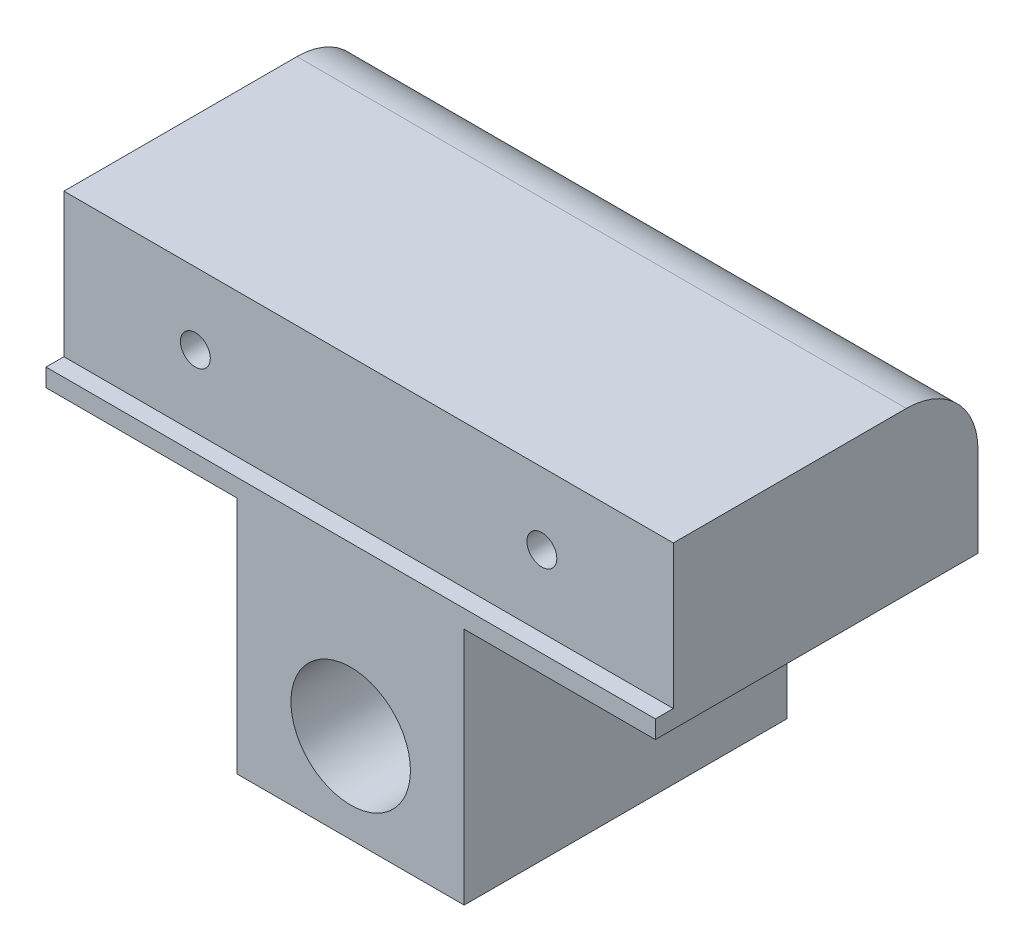
ISO-10303-21;
HEADER;
FILE_DESCRIPTION(('STEP AP214'),'2;1');
FILE_NAME('part.step','',(''),(''),'','','');
FILE_SCHEMA(('AUTOMOTIVE_DESIGN { 1 0 10303 214 1 1 1 1 }'));
ENDSEC;
DATA;
#1=APPLICATION_CONTEXT('core data for automotive mechanical design processes');
#2=APPLICATION_PROTOCOL_DEFINITION('international standard','automotive_design',2000,#1);
#3=PRODUCT_CONTEXT('',#1,'mechanical');
#4=PRODUCT('Part','Part','',(#3));
#5=PRODUCT_RELATED_PRODUCT_CATEGORY('part','',(#4));
#6=PRODUCT_DEFINITION_FORMATION('','',#4);
#7=PRODUCT_DEFINITION_CONTEXT('part definition',#1,'design');
#8=PRODUCT_DEFINITION('design','',#6,#7);
#9=PRODUCT_DEFINITION_SHAPE('','',#8);
#10=(LENGTH_UNIT() NAMED_UNIT(*) SI_UNIT(.MILLI.,.METRE.));
#11=(NAMED_UNIT(*) PLANE_ANGLE_UNIT() SI_UNIT($,.RADIAN.));
#12=(NAMED_UNIT(*) SI_UNIT($,.STERADIAN.) SOLID_ANGLE_UNIT());
#13=UNCERTAINTY_MEASURE_WITH_UNIT(LENGTH_MEASURE(1.E-05),#10,'distance_accuracy_value','');
#14=(GEOMETRIC_REPRESENTATION_CONTEXT(3) GLOBAL_UNCERTAINTY_ASSIGNED_CONTEXT((#13)) GLOBAL_UNIT_ASSIGNED_CONTEXT((#10,
#11,#12)) REPRESENTATION_CONTEXT('',''));
#15=CARTESIAN_POINT('',(0.,0.,0.));
#16=DIRECTION('',(0.,0.,1.));
#17=DIRECTION('',(1.,0.,0.));
#18=AXIS2_PLACEMENT_3D('',#15,#16,#17);
#19=CARTESIAN_POINT('',(102.,25.,8.36101549053358));
#20=DIRECTION('',(0.,1.,0.));
#21=DIRECTION('',(0.,0.,1.));
#22=AXIS2_PLACEMENT_3D('',#19,#20,#21);
#23=PLANE('',#22);
#24=DIRECTION('',(0.,0.,1.));
#25=VECTOR('',#24,1.);
#26=CARTESIAN_POINT('',(70.,25.,-45.6389845094664));
#27=LINE('',#26,#25);
#28=CARTESIAN_POINT('',(70.,25.,-45.6389845094664));
#29=VERTEX_POINT('',#28);
#30=CARTESIAN_POINT('',(70.,25.,8.36101549053358));
#31=VERTEX_POINT('',#30);
#32=EDGE_CURVE('E127',#29,#31,#27,.T.);
#33=ORIENTED_EDGE('',*,*,#32,.F.);
#34=DIRECTION('',(-1.,0.,0.));
#35=VECTOR('',#34,1.);
#36=CARTESIAN_POINT('',(102.,25.,-45.6389845094664));
#37=LINE('',#36,#35);
#38=CARTESIAN_POINT('',(102.,25.,-45.6389845094664));
#39=VERTEX_POINT('',#38);
#40=EDGE_CURVE('E124',#39,#29,#37,.T.);
#41=ORIENTED_EDGE('',*,*,#40,.F.);
#42=DIRECTION('',(0.,0.,-1.));
#43=VECTOR('',#42,1.);
#44=CARTESIAN_POINT('',(102.,25.,8.36101549053358));
#45=LINE('',#44,#43);
#46=CARTESIAN_POINT('',(102.,25.,8.36101549053358));
#47=VERTEX_POINT('',#46);
#48=EDGE_CURVE('E110',#47,#39,#45,.T.);
#49=ORIENTED_EDGE('',*,*,#48,.F.);
#50=DIRECTION('',(-1.,0.,0.));
#51=VECTOR('',#50,1.);
#52=CARTESIAN_POINT('',(102.,25.,8.36101549053358));
#53=LINE('',#52,#51);
#54=EDGE_CURVE('E171',#47,#31,#53,.T.);
#55=ORIENTED_EDGE('',*,*,#54,.T.);
#56=EDGE_LOOP('',(#33,#41,#49,#55));
#57=FACE_BOUND('',#56,.T.);
#58=ADVANCED_FACE('F33',(#57),#23,.F.);
#59=CARTESIAN_POINT('',(102.,52.,-33.6389845094664));
#60=DIRECTION('',(0.,-1.,0.));
#61=DIRECTION('',(0.,0.,-1.));
#62=AXIS2_PLACEMENT_3D('',#59,#60,#61);
#63=PLANE('',#62);
#64=DIRECTION('',(0.,0.,1.));
#65=VECTOR('',#64,1.);
#66=CARTESIAN_POINT('',(0.,52.,-33.6389845094664));
#67=LINE('',#66,#65);
#68=CARTESIAN_POINT('',(0.,52.,-33.6389845094664));
#69=VERTEX_POINT('',#68);
#70=CARTESIAN_POINT('',(0.,52.,5.36101549053358));
#71=VERTEX_POINT('',#70);
#72=EDGE_CURVE('E140',#69,#71,#67,.T.);
#73=ORIENTED_EDGE('',*,*,#72,.T.);
#74=DIRECTION('',(-1.,0.,0.));
#75=VECTOR('',#74,1.);
#76=CARTESIAN_POINT('',(102.,52.,5.36101549053358));
#77=LINE('',#76,#75);
#78=CARTESIAN_POINT('',(102.,52.,5.36101549053358));
#79=VERTEX_POINT('',#78);
#80=EDGE_CURVE('E11',#79,#71,#77,.T.);
#81=ORIENTED_EDGE('',*,*,#80,.F.);
#82=DIRECTION('',(0.,0.,1.));
#83=VECTOR('',#82,1.);
#84=CARTESIAN_POINT('',(102.,52.,-33.6389845094664));
#85=LINE('',#84,#83);
#86=CARTESIAN_POINT('',(102.,52.,-33.6389845094664));
#87=VERTEX_POINT('',#86);
#88=EDGE_CURVE('E157',#87,#79,#85,.T.);
#89=ORIENTED_EDGE('',*,*,#88,.F.);
#90=DIRECTION('',(-1.,0.,0.));
#91=VECTOR('',#90,1.);
#92=CARTESIAN_POINT('',(102.,52.,-33.6389845094664));
#93=LINE('',#92,#91);
#94=EDGE_CURVE('E136',#87,#69,#93,.T.);
#95=ORIENTED_EDGE('',*,*,#94,.T.);
#96=EDGE_LOOP('',(#73,#81,#89,#95));
#97=FACE_BOUND('',#96,.T.);
#98=ADVANCED_FACE('F35',(#97),#63,.F.);
#99=CARTESIAN_POINT('',(102.,52.,5.36101549053358));
#100=DIRECTION('',(0.,0.,-1.));
#101=DIRECTION('',(-1.,0.,0.));
#102=AXIS2_PLACEMENT_3D('',#99,#100,#101);
#103=PLANE('',#102);
#104=CARTESIAN_POINT('',(22.,40.,5.36101549053358));
#105=DIRECTION('',(0.,0.,1.));
#106=DIRECTION('',(1.,0.,0.));
#107=AXIS2_PLACEMENT_3D('',#104,#105,#106);
#108=CIRCLE('',#107,2.49999999999999);
#109=CARTESIAN_POINT('',(24.5,40.,5.36101549053358));
#110=VERTEX_POINT('',#109);
#111=EDGE_CURVE('E262',#110,#110,#108,.T.);
#112=ORIENTED_EDGE('',*,*,#111,.F.);
#113=EDGE_LOOP('',(#112));
#114=FACE_BOUND('',#113,.T.);
#115=CARTESIAN_POINT('',(80.,40.,5.36101549053358));
#116=DIRECTION('',(0.,0.,1.));
#117=DIRECTION('',(1.,0.,0.));
#118=AXIS2_PLACEMENT_3D('',#115,#116,#117);
#119=CIRCLE('',#118,2.49999999999999);
#120=CARTESIAN_POINT('',(82.5,40.,5.36101549053358));
#121=VERTEX_POINT('',#120);
#122=EDGE_CURVE('E268',#121,#121,#119,.T.);
#123=ORIENTED_EDGE('',*,*,#122,.F.);
#124=EDGE_LOOP('',(#123));
#125=FACE_BOUND('',#124,.T.);
#126=DIRECTION('',(0.,-1.,0.));
#127=VECTOR('',#126,1.);
#128=CARTESIAN_POINT('',(0.,52.,5.36101549053358));
#129=LINE('',#128,#127);
#130=CARTESIAN_POINT('',(0.,28.,5.36101549053358));
#131=VERTEX_POINT('',#130);
#132=EDGE_CURVE('E143',#71,#131,#129,.T.);
#133=ORIENTED_EDGE('',*,*,#132,.T.);
#134=DIRECTION('',(-1.,0.,0.));
#135=VECTOR('',#134,1.);
#136=CARTESIAN_POINT('',(102.,28.,5.36101549053358));
#137=LINE('',#136,#135);
#138=CARTESIAN_POINT('',(102.,28.,5.36101549053358));
#139=VERTEX_POINT('',#138);
#140=EDGE_CURVE('E42',#139,#131,#137,.T.);
#141=ORIENTED_EDGE('',*,*,#140,.F.);
#142=DIRECTION('',(0.,-1.,0.));
#143=VECTOR('',#142,1.);
#144=CARTESIAN_POINT('',(102.,52.,5.36101549053358));
#145=LINE('',#144,#143);
#146=EDGE_CURVE('E97',#79,#139,#145,.T.);
#147=ORIENTED_EDGE('',*,*,#146,.F.);
#148=ORIENTED_EDGE('',*,*,#80,.T.);
#149=EDGE_LOOP('',(#133,#141,#147,#148));
#150=FACE_BOUND('',#149,.T.);
#151=ADVANCED_FACE('F298',(#114,#125,#150),#103,.F.);
#152=CARTESIAN_POINT('',(102.,28.,5.36101549053358));
#153=DIRECTION('',(0.,-1.,0.));
#154=DIRECTION('',(0.,0.,-1.));
#155=AXIS2_PLACEMENT_3D('',#152,#153,#154);
#156=PLANE('',#155);
#157=DIRECTION('',(0.,0.,1.));
#158=VECTOR('',#157,1.);
#159=CARTESIAN_POINT('',(0.,28.,5.36101549053358));
#160=LINE('',#159,#158);
#161=CARTESIAN_POINT('',(0.,28.,8.36101549053358));
#162=VERTEX_POINT('',#161);
#163=EDGE_CURVE('E146',#131,#162,#160,.T.);
#164=ORIENTED_EDGE('',*,*,#163,.T.);
#165=DIRECTION('',(-1.,0.,0.));
#166=VECTOR('',#165,1.);
#167=CARTESIAN_POINT('',(102.,28.,8.36101549053358));
#168=LINE('',#167,#166);
#169=CARTESIAN_POINT('',(102.,28.,8.36101549053358));
#170=VERTEX_POINT('',#169);
#171=EDGE_CURVE('E169',#170,#162,#168,.T.);
#172=ORIENTED_EDGE('',*,*,#171,.F.);
#173=DIRECTION('',(0.,0.,1.));
#174=VECTOR('',#173,1.);
#175=CARTESIAN_POINT('',(102.,28.,5.36101549053358));
#176=LINE('',#175,#174);
#177=EDGE_CURVE('E292',#139,#170,#176,.T.);
#178=ORIENTED_EDGE('',*,*,#177,.F.);
#179=ORIENTED_EDGE('',*,*,#140,.T.);
#180=EDGE_LOOP('',(#164,#172,#178,#179));
#181=FACE_BOUND('',#180,.T.);
#182=ADVANCED_FACE('F297',(#181),#156,.F.);
#183=CARTESIAN_POINT('',(102.,28.,8.36101549053358));
#184=DIRECTION('',(0.,0.,-1.));
#185=DIRECTION('',(-1.,0.,0.));
#186=AXIS2_PLACEMENT_3D('',#183,#184,#185);
#187=PLANE('',#186);
#188=CARTESIAN_POINT('',(51.,0.,8.36101549053358));
#189=DIRECTION('',(0.,0.,1.));
#190=DIRECTION('',(1.,0.,0.));
#191=AXIS2_PLACEMENT_3D('',#188,#189,#190);
#192=CIRCLE('',#191,10.);
#193=CARTESIAN_POINT('',(61.,0.,8.36101549053358));
#194=VERTEX_POINT('',#193);
#195=EDGE_CURVE('E274',#194,#194,#192,.T.);
#196=ORIENTED_EDGE('',*,*,#195,.F.);
#197=EDGE_LOOP('',(#196));
#198=FACE_BOUND('',#197,.T.);
#199=DIRECTION('',(0.,-1.,0.));
#200=VECTOR('',#199,1.);
#201=CARTESIAN_POINT('',(0.,28.,8.36101549053358));
#202=LINE('',#201,#200);
#203=CARTESIAN_POINT('',(0.,25.,8.36101549053358));
#204=VERTEX_POINT('',#203);
#205=EDGE_CURVE('E148',#162,#204,#202,.T.);
#206=ORIENTED_EDGE('',*,*,#205,.T.);
#207=CARTESIAN_POINT('',(32.,25.,8.36101549053358));
#208=VERTEX_POINT('',#207);
#209=EDGE_CURVE('E130',#208,#204,#53,.T.);
#210=ORIENTED_EDGE('',*,*,#209,.F.);
#211=DIRECTION('',(0.,-1.,0.));
#212=VECTOR('',#211,1.);
#213=CARTESIAN_POINT('',(32.,25.,8.36101549053358));
#214=LINE('',#213,#212);
#215=CARTESIAN_POINT('',(32.,-15.,8.36101549053358));
#216=VERTEX_POINT('',#215);
#217=EDGE_CURVE('E50',#208,#216,#214,.T.);
#218=ORIENTED_EDGE('',*,*,#217,.T.);
#219=DIRECTION('',(1.,0.,0.));
#220=VECTOR('',#219,1.);
#221=CARTESIAN_POINT('',(32.,-15.,8.36101549053358));
#222=LINE('',#221,#220);
#223=CARTESIAN_POINT('',(70.,-15.,8.36101549053358));
#224=VERTEX_POINT('',#223);
#225=EDGE_CURVE('E178',#216,#224,#222,.T.);
#226=ORIENTED_EDGE('',*,*,#225,.T.);
#227=DIRECTION('',(0.,1.,0.));
#228=VECTOR('',#227,1.);
#229=CARTESIAN_POINT('',(70.,25.,8.36101549053358));
#230=LINE('',#229,#228);
#231=EDGE_CURVE('E203',#224,#31,#230,.T.);
#232=ORIENTED_EDGE('',*,*,#231,.T.);
#233=ORIENTED_EDGE('',*,*,#54,.F.);
#234=DIRECTION('',(0.,-1.,0.));
#235=VECTOR('',#234,1.);
#236=CARTESIAN_POINT('',(102.,28.,8.36101549053358));
#237=LINE('',#236,#235);
#238=EDGE_CURVE('E117',#170,#47,#237,.T.);
#239=ORIENTED_EDGE('',*,*,#238,.F.);
#240=ORIENTED_EDGE('',*,*,#171,.T.);
#241=EDGE_LOOP('',(#206,#210,#218,#226,#232,#233,#239,#240));
#242=FACE_BOUND('',#241,.T.);
#243=ADVANCED_FACE('F211',(#198,#242),#187,.F.);
#244=CARTESIAN_POINT('',(32.,25.,-45.6389845094664));
#245=VERTEX_POINT('',#244);
#246=CARTESIAN_POINT('',(0.,25.,-45.6389845094664));
#247=VERTEX_POINT('',#246);
#248=EDGE_CURVE('E131',#245,#247,#37,.T.);
#249=ORIENTED_EDGE('',*,*,#248,.F.);
#250=DIRECTION('',(0.,0.,1.));
#251=VECTOR('',#250,1.);
#252=CARTESIAN_POINT('',(32.,25.,-45.6389845094664));
#253=LINE('',#252,#251);
#254=EDGE_CURVE('E144',#245,#208,#253,.T.);
#255=ORIENTED_EDGE('',*,*,#254,.T.);
#256=ORIENTED_EDGE('',*,*,#209,.T.);
#257=DIRECTION('',(0.,0.,-1.));
#258=VECTOR('',#257,1.);
#259=CARTESIAN_POINT('',(0.,25.,8.36101549053358));
#260=LINE('',#259,#258);
#261=EDGE_CURVE('E151',#204,#247,#260,.T.);
#262=ORIENTED_EDGE('',*,*,#261,.T.);
#263=EDGE_LOOP('',(#249,#255,#256,#262));
#264=FACE_BOUND('',#263,.T.);
#265=ADVANCED_FACE('F280',(#264),#23,.F.);
#266=CARTESIAN_POINT('',(102.,25.,-45.6389845094664));
#267=DIRECTION('',(0.,0.,1.));
#268=DIRECTION('',(1.,0.,0.));
#269=AXIS2_PLACEMENT_3D('',#266,#267,#268);
#270=PLANE('',#269);
#271=CARTESIAN_POINT('',(51.,0.,-45.6389845094664));
#272=DIRECTION('',(0.,0.,1.));
#273=DIRECTION('',(1.,0.,0.));
#274=AXIS2_PLACEMENT_3D('',#271,#272,#273);
#275=CIRCLE('',#274,10.);
#276=CARTESIAN_POINT('',(61.,0.,-45.6389845094664));
#277=VERTEX_POINT('',#276);
#278=EDGE_CURVE('E37',#277,#277,#275,.T.);
#279=ORIENTED_EDGE('',*,*,#278,.T.);
#280=EDGE_LOOP('',(#279));
#281=FACE_BOUND('',#280,.T.);
#282=DIRECTION('',(0.,1.,0.));
#283=VECTOR('',#282,1.);
#284=CARTESIAN_POINT('',(0.,25.,-45.6389845094664));
#285=LINE('',#284,#283);
#286=CARTESIAN_POINT('',(0.,40.,-45.6389845094664));
#287=VERTEX_POINT('',#286);
#288=EDGE_CURVE('E154',#247,#287,#285,.T.);
#289=ORIENTED_EDGE('',*,*,#288,.T.);
#290=DIRECTION('',(-1.,0.,0.));
#291=VECTOR('',#290,1.);
#292=CARTESIAN_POINT('',(102.,40.,-45.6389845094664));
#293=LINE('',#292,#291);
#294=CARTESIAN_POINT('',(102.,40.,-45.6389845094664));
#295=VERTEX_POINT('',#294);
#296=EDGE_CURVE('E134',#295,#287,#293,.T.);
#297=ORIENTED_EDGE('',*,*,#296,.F.);
#298=DIRECTION('',(0.,1.,0.));
#299=VECTOR('',#298,1.);
#300=CARTESIAN_POINT('',(102.,25.,-45.6389845094664));
#301=LINE('',#300,#299);
#302=EDGE_CURVE('E114',#39,#295,#301,.T.);
#303=ORIENTED_EDGE('',*,*,#302,.F.);
#304=ORIENTED_EDGE('',*,*,#40,.T.);
#305=DIRECTION('',(0.,1.,0.));
#306=VECTOR('',#305,1.);
#307=CARTESIAN_POINT('',(70.,25.,-45.6389845094664));
#308=LINE('',#307,#306);
#309=CARTESIAN_POINT('',(70.,-15.,-45.6389845094664));
#310=VERTEX_POINT('',#309);
#311=EDGE_CURVE('E196',#310,#29,#308,.T.);
#312=ORIENTED_EDGE('',*,*,#311,.F.);
#313=DIRECTION('',(1.,0.,0.));
#314=VECTOR('',#313,1.);
#315=CARTESIAN_POINT('',(32.,-15.,-45.6389845094664));
#316=LINE('',#315,#314);
#317=CARTESIAN_POINT('',(32.,-15.,-45.6389845094664));
#318=VERTEX_POINT('',#317);
#319=EDGE_CURVE('E200',#318,#310,#316,.T.);
#320=ORIENTED_EDGE('',*,*,#319,.F.);
#321=DIRECTION('',(0.,-1.,0.));
#322=VECTOR('',#321,1.);
#323=CARTESIAN_POINT('',(32.,25.,-45.6389845094664));
#324=LINE('',#323,#322);
#325=EDGE_CURVE('E183',#245,#318,#324,.T.);
#326=ORIENTED_EDGE('',*,*,#325,.F.);
#327=ORIENTED_EDGE('',*,*,#248,.T.);
#328=EDGE_LOOP('',(#289,#297,#303,#304,#312,#320,#326,#327));
#329=FACE_BOUND('',#328,.T.);
#330=ADVANCED_FACE('F133',(#281,#329),#270,.F.);
#331=CARTESIAN_POINT('',(102.,40.,-33.6389845094664));
#332=DIRECTION('',(-1.,0.,0.));
#333=DIRECTION('',(0.,0.,1.));
#334=AXIS2_PLACEMENT_3D('',#331,#332,#333);
#335=CYLINDRICAL_SURFACE('',#334,12.);
#336=CARTESIAN_POINT('',(0.,40.,-33.6389845094664));
#337=DIRECTION('',(1.,0.,0.));
#338=DIRECTION('',(0.,0.,-1.));
#339=AXIS2_PLACEMENT_3D('',#336,#337,#338);
#340=CIRCLE('',#339,12.);
#341=EDGE_CURVE('E89',#287,#69,#340,.T.);
#342=ORIENTED_EDGE('',*,*,#341,.T.);
#343=ORIENTED_EDGE('',*,*,#94,.F.);
#344=CARTESIAN_POINT('',(102.,40.,-33.6389845094664));
#345=DIRECTION('',(1.,0.,0.));
#346=DIRECTION('',(0.,0.,-1.));
#347=AXIS2_PLACEMENT_3D('',#344,#345,#346);
#348=CIRCLE('',#347,12.);
#349=EDGE_CURVE('E59',#295,#87,#348,.T.);
#350=ORIENTED_EDGE('',*,*,#349,.F.);
#351=ORIENTED_EDGE('',*,*,#296,.T.);
#352=EDGE_LOOP('',(#342,#343,#350,#351));
#353=FACE_BOUND('',#352,.T.);
#354=ADVANCED_FACE('F287',(#353),#335,.T.);
#355=CARTESIAN_POINT('',(102.,40.,-33.6389845094664));
#356=DIRECTION('',(1.,0.,0.));
#357=DIRECTION('',(0.,0.,-1.));
#358=AXIS2_PLACEMENT_3D('',#355,#356,#357);
#359=PLANE('',#358);
#360=ORIENTED_EDGE('',*,*,#88,.T.);
#361=ORIENTED_EDGE('',*,*,#146,.T.);
#362=ORIENTED_EDGE('',*,*,#177,.T.);
#363=ORIENTED_EDGE('',*,*,#238,.T.);
#364=ORIENTED_EDGE('',*,*,#48,.T.);
#365=ORIENTED_EDGE('',*,*,#302,.T.);
#366=ORIENTED_EDGE('',*,*,#349,.T.);
#367=EDGE_LOOP('',(#360,#361,#362,#363,#364,#365,#366));
#368=FACE_BOUND('',#367,.T.);
#369=ADVANCED_FACE('F112',(#368),#359,.T.);
#370=CARTESIAN_POINT('',(0.,40.,-33.6389845094664));
#371=DIRECTION('',(1.,0.,0.));
#372=DIRECTION('',(0.,0.,-1.));
#373=AXIS2_PLACEMENT_3D('',#370,#371,#372);
#374=PLANE('',#373);
#375=ORIENTED_EDGE('',*,*,#72,.F.);
#376=ORIENTED_EDGE('',*,*,#341,.F.);
#377=ORIENTED_EDGE('',*,*,#288,.F.);
#378=ORIENTED_EDGE('',*,*,#261,.F.);
#379=ORIENTED_EDGE('',*,*,#205,.F.);
#380=ORIENTED_EDGE('',*,*,#163,.F.);
#381=ORIENTED_EDGE('',*,*,#132,.F.);
#382=EDGE_LOOP('',(#375,#376,#377,#378,#379,#380,#381));
#383=FACE_BOUND('',#382,.T.);
#384=ADVANCED_FACE('F286',(#383),#374,.F.);
#385=CARTESIAN_POINT('',(32.,25.,-45.6389845094664));
#386=DIRECTION('',(-1.,0.,0.));
#387=DIRECTION('',(0.,-1.,0.));
#388=AXIS2_PLACEMENT_3D('',#385,#386,#387);
#389=PLANE('',#388);
#390=ORIENTED_EDGE('',*,*,#217,.F.);
#391=ORIENTED_EDGE('',*,*,#254,.F.);
#392=ORIENTED_EDGE('',*,*,#325,.T.);
#393=DIRECTION('',(0.,0.,1.));
#394=VECTOR('',#393,1.);
#395=CARTESIAN_POINT('',(32.,-15.,-45.6389845094664));
#396=LINE('',#395,#394);
#397=EDGE_CURVE('E199',#318,#216,#396,.T.);
#398=ORIENTED_EDGE('',*,*,#397,.T.);
#399=EDGE_LOOP('',(#390,#391,#392,#398));
#400=FACE_BOUND('',#399,.T.);
#401=ADVANCED_FACE('F278',(#400),#389,.T.);
#402=CARTESIAN_POINT('',(70.,25.,-45.6389845094664));
#403=DIRECTION('',(1.,0.,0.));
#404=DIRECTION('',(0.,0.,-1.));
#405=AXIS2_PLACEMENT_3D('',#402,#403,#404);
#406=PLANE('',#405);
#407=ORIENTED_EDGE('',*,*,#231,.F.);
#408=DIRECTION('',(0.,0.,1.));
#409=VECTOR('',#408,1.);
#410=CARTESIAN_POINT('',(70.,-15.,-45.6389845094664));
#411=LINE('',#410,#409);
#412=EDGE_CURVE('E191',#310,#224,#411,.T.);
#413=ORIENTED_EDGE('',*,*,#412,.F.);
#414=ORIENTED_EDGE('',*,*,#311,.T.);
#415=ORIENTED_EDGE('',*,*,#32,.T.);
#416=EDGE_LOOP('',(#407,#413,#414,#415));
#417=FACE_BOUND('',#416,.T.);
#418=ADVANCED_FACE('F339',(#417),#406,.T.);
#419=CARTESIAN_POINT('',(32.,-15.,-45.6389845094664));
#420=DIRECTION('',(0.,-1.,0.));
#421=DIRECTION('',(1.,0.,0.));
#422=AXIS2_PLACEMENT_3D('',#419,#420,#421);
#423=PLANE('',#422);
#424=CARTESIAN_POINT('',(39.,-15.,-18.6389845094664));
#425=DIRECTION('',(0.,-1.,0.));
#426=DIRECTION('',(0.,0.,-1.));
#427=AXIS2_PLACEMENT_3D('',#424,#425,#426);
#428=CIRCLE('',#427,2.49999999999999);
#429=CARTESIAN_POINT('',(39.,-15.,-21.1389845094664));
#430=VERTEX_POINT('',#429);
#431=EDGE_CURVE('E252',#430,#430,#428,.T.);
#432=ORIENTED_EDGE('',*,*,#431,.F.);
#433=EDGE_LOOP('',(#432));
#434=FACE_BOUND('',#433,.T.);
#435=CARTESIAN_POINT('',(63.,-15.,-18.6389845094664));
#436=DIRECTION('',(0.,-1.,0.));
#437=DIRECTION('',(0.,0.,-1.));
#438=AXIS2_PLACEMENT_3D('',#435,#436,#437);
#439=CIRCLE('',#438,2.49999999999999);
#440=CARTESIAN_POINT('',(63.,-15.,-21.1389845094664));
#441=VERTEX_POINT('',#440);
#442=EDGE_CURVE('E251',#441,#441,#439,.T.);
#443=ORIENTED_EDGE('',*,*,#442,.F.);
#444=EDGE_LOOP('',(#443));
#445=FACE_BOUND('',#444,.T.);
#446=ORIENTED_EDGE('',*,*,#225,.F.);
#447=ORIENTED_EDGE('',*,*,#397,.F.);
#448=ORIENTED_EDGE('',*,*,#319,.T.);
#449=ORIENTED_EDGE('',*,*,#412,.T.);
#450=EDGE_LOOP('',(#446,#447,#448,#449));
#451=FACE_BOUND('',#450,.T.);
#452=ADVANCED_FACE('F217',(#434,#445,#451),#423,.T.);
#453=CARTESIAN_POINT('',(51.,0.,-45.6390345094664));
#454=DIRECTION('',(0.,0.,1.));
#455=DIRECTION('',(1.,0.,0.));
#456=AXIS2_PLACEMENT_3D('',#453,#454,#455);
#457=CYLINDRICAL_SURFACE('',#456,10.);
#458=ORIENTED_EDGE('',*,*,#195,.T.);
#459=EDGE_LOOP('',(#458));
#460=FACE_BOUND('',#459,.T.);
#461=ORIENTED_EDGE('',*,*,#278,.F.);
#462=EDGE_LOOP('',(#461));
#463=FACE_BOUND('',#462,.T.);
#464=ADVANCED_FACE('F325',(#460,#463),#457,.F.);
#465=CARTESIAN_POINT('',(80.,40.,-8.63898450946642));
#466=DIRECTION('',(0.,0.,1.));
#467=DIRECTION('',(1.,0.,0.));
#468=AXIS2_PLACEMENT_3D('',#465,#466,#467);
#469=CONICAL_SURFACE('',#468,2.5,1.02974425867666);
#470=CARTESIAN_POINT('',(80.,40.,-10.1411360570353));
#471=VERTEX_POINT('',#470);
#472=VERTEX_LOOP('',#471);
#473=FACE_BOUND('',#472,.T.);
#474=CARTESIAN_POINT('',(80.,40.,-8.63898450946642));
#475=DIRECTION('',(0.,0.,1.));
#476=DIRECTION('',(1.,0.,0.));
#477=AXIS2_PLACEMENT_3D('',#474,#475,#476);
#478=CIRCLE('',#477,2.5);
#479=CARTESIAN_POINT('',(82.5,40.,-8.63898450946642));
#480=VERTEX_POINT('',#479);
#481=EDGE_CURVE('E271',#480,#480,#478,.T.);
#482=ORIENTED_EDGE('',*,*,#481,.T.);
#483=EDGE_LOOP('',(#482));
#484=FACE_BOUND('',#483,.T.);
#485=ADVANCED_FACE('F328',(#473,#484),#469,.F.);
#486=CARTESIAN_POINT('',(80.,40.,5.36101549053358));
#487=DIRECTION('',(0.,0.,1.));
#488=DIRECTION('',(1.,0.,0.));
#489=AXIS2_PLACEMENT_3D('',#486,#487,#488);
#490=CYLINDRICAL_SURFACE('',#489,2.5);
#491=ORIENTED_EDGE('',*,*,#481,.F.);
#492=EDGE_LOOP('',(#491));
#493=FACE_BOUND('',#492,.T.);
#494=ORIENTED_EDGE('',*,*,#122,.T.);
#495=EDGE_LOOP('',(#494));
#496=FACE_BOUND('',#495,.T.);
#497=ADVANCED_FACE('F336',(#493,#496),#490,.F.);
#498=CARTESIAN_POINT('',(22.,40.,-8.63898450946642));
#499=DIRECTION('',(0.,0.,1.));
#500=DIRECTION('',(1.,0.,0.));
#501=AXIS2_PLACEMENT_3D('',#498,#499,#500);
#502=CONICAL_SURFACE('',#501,2.5,1.02974425867665);
#503=CARTESIAN_POINT('',(22.,40.,-10.1411360570353));
#504=VERTEX_POINT('',#503);
#505=VERTEX_LOOP('',#504);
#506=FACE_BOUND('',#505,.T.);
#507=CARTESIAN_POINT('',(22.,40.,-8.63898450946642));
#508=DIRECTION('',(0.,0.,1.));
#509=DIRECTION('',(1.,0.,0.));
#510=AXIS2_PLACEMENT_3D('',#507,#508,#509);
#511=CIRCLE('',#510,2.5);
#512=CARTESIAN_POINT('',(24.5,40.,-8.63898450946642));
#513=VERTEX_POINT('',#512);
#514=EDGE_CURVE('E265',#513,#513,#511,.T.);
#515=ORIENTED_EDGE('',*,*,#514,.T.);
#516=EDGE_LOOP('',(#515));
#517=FACE_BOUND('',#516,.T.);
#518=ADVANCED_FACE('F430',(#506,#517),#502,.F.);
#519=CARTESIAN_POINT('',(22.,40.,5.36101549053358));
#520=DIRECTION('',(0.,0.,1.));
#521=DIRECTION('',(1.,0.,0.));
#522=AXIS2_PLACEMENT_3D('',#519,#520,#521);
#523=CYLINDRICAL_SURFACE('',#522,2.49999999999999);
#524=ORIENTED_EDGE('',*,*,#514,.F.);
#525=EDGE_LOOP('',(#524));
#526=FACE_BOUND('',#525,.T.);
#527=ORIENTED_EDGE('',*,*,#111,.T.);
#528=EDGE_LOOP('',(#527));
#529=FACE_BOUND('',#528,.T.);
#530=ADVANCED_FACE('F386',(#526,#529),#523,.F.);
#531=CARTESIAN_POINT('',(63.,-5.,-18.6389845094664));
#532=DIRECTION('',(0.,-1.,0.));
#533=DIRECTION('',(0.,0.,-1.));
#534=AXIS2_PLACEMENT_3D('',#531,#532,#533);
#535=CONICAL_SURFACE('',#534,2.5,1.02974425867665);
#536=CARTESIAN_POINT('',(63.,-3.4978484524311,-18.6389845094664));
#537=VERTEX_POINT('',#536);
#538=VERTEX_LOOP('',#537);
#539=FACE_BOUND('',#538,.T.);
#540=CARTESIAN_POINT('',(63.,-5.,-18.6389845094664));
#541=DIRECTION('',(0.,-1.,0.));
#542=DIRECTION('',(0.,0.,-1.));
#543=AXIS2_PLACEMENT_3D('',#540,#541,#542);
#544=CIRCLE('',#543,2.5);
#545=CARTESIAN_POINT('',(63.,-5.,-21.1389845094664));
#546=VERTEX_POINT('',#545);
#547=EDGE_CURVE('E255',#546,#546,#544,.T.);
#548=ORIENTED_EDGE('',*,*,#547,.T.);
#549=EDGE_LOOP('',(#548));
#550=FACE_BOUND('',#549,.T.);
#551=ADVANCED_FACE('F391',(#539,#550),#535,.F.);
#552=CARTESIAN_POINT('',(63.,-15.,-18.6389845094664));
#553=DIRECTION('',(0.,-1.,0.));
#554=DIRECTION('',(0.,0.,-1.));
#555=AXIS2_PLACEMENT_3D('',#552,#553,#554);
#556=CYLINDRICAL_SURFACE('',#555,2.5);
#557=ORIENTED_EDGE('',*,*,#547,.F.);
#558=EDGE_LOOP('',(#557));
#559=FACE_BOUND('',#558,.T.);
#560=ORIENTED_EDGE('',*,*,#442,.T.);
#561=EDGE_LOOP('',(#560));
#562=FACE_BOUND('',#561,.T.);
#563=ADVANCED_FACE('F245',(#559,#562),#556,.F.);
#564=CARTESIAN_POINT('',(39.,-5.,-18.6389845094664));
#565=DIRECTION('',(0.,-1.,0.));
#566=DIRECTION('',(0.,0.,-1.));
#567=AXIS2_PLACEMENT_3D('',#564,#565,#566);
#568=CONICAL_SURFACE('',#567,2.5,1.02974425867665);
#569=CARTESIAN_POINT('',(39.,-3.49784845243109,-18.6389845094664));
#570=VERTEX_POINT('',#569);
#571=VERTEX_LOOP('',#570);
#572=FACE_BOUND('',#571,.T.);
#573=CARTESIAN_POINT('',(39.,-5.,-18.6389845094664));
#574=DIRECTION('',(0.,-1.,0.));
#575=DIRECTION('',(0.,0.,-1.));
#576=AXIS2_PLACEMENT_3D('',#573,#574,#575);
#577=CIRCLE('',#576,2.5);
#578=CARTESIAN_POINT('',(39.,-5.,-21.1389845094664));
#579=VERTEX_POINT('',#578);
#580=EDGE_CURVE('E249',#579,#579,#577,.T.);
#581=ORIENTED_EDGE('',*,*,#580,.T.);
#582=EDGE_LOOP('',(#581));
#583=FACE_BOUND('',#582,.T.);
#584=ADVANCED_FACE('F241',(#572,#583),#568,.F.);
#585=CARTESIAN_POINT('',(39.,-15.,-18.6389845094664));
#586=DIRECTION('',(0.,-1.,0.));
#587=DIRECTION('',(0.,0.,-1.));
#588=AXIS2_PLACEMENT_3D('',#585,#586,#587);
#589=CYLINDRICAL_SURFACE('',#588,2.49999999999999);
#590=ORIENTED_EDGE('',*,*,#580,.F.);
#591=EDGE_LOOP('',(#590));
#592=FACE_BOUND('',#591,.T.);
#593=ORIENTED_EDGE('',*,*,#431,.T.);
#594=EDGE_LOOP('',(#593));
#595=FACE_BOUND('',#594,.T.);
#596=ADVANCED_FACE('F244',(#592,#595),#589,.F.);
#597=CLOSED_SHELL('',(#58,#98,#151,#182,#243,#265,#330,#354,#369,#384,#401,#418,#452,#464,#485,
#497,#518,#530,#551,#563,#584,#596));
#598=MANIFOLD_SOLID_BREP('B2',#597);
#599=ADVANCED_BREP_SHAPE_REPRESENTATION('',(#18,#598),#14);
#600=SHAPE_DEFINITION_REPRESENTATION(#9,#599);
ENDSEC;
END-ISO-10303-21;
